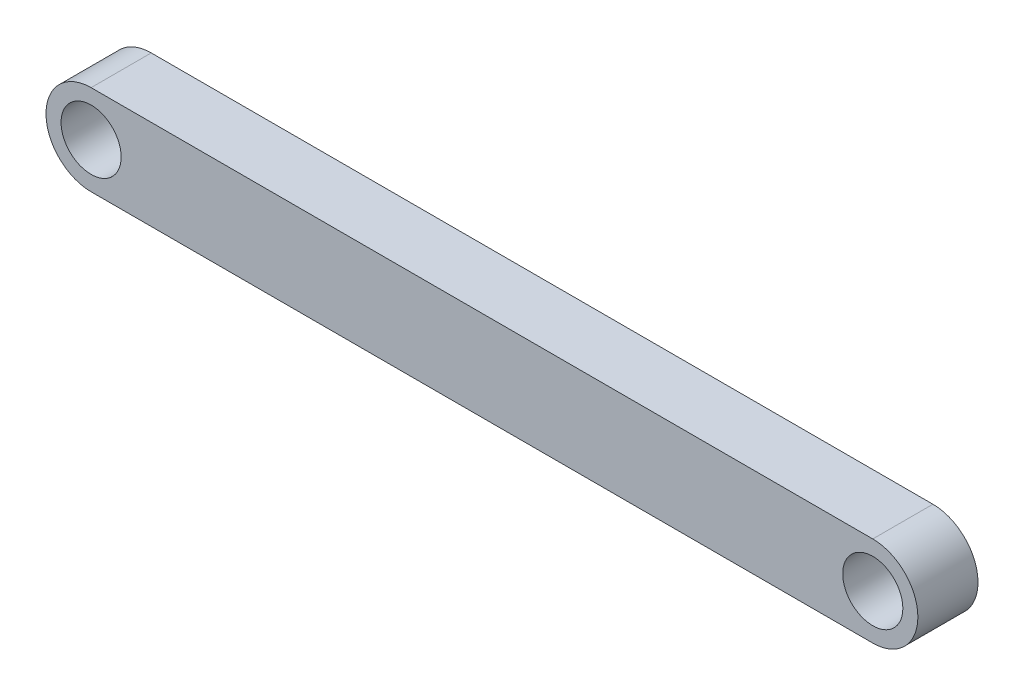
ISO-10303-21;
HEADER;
FILE_DESCRIPTION(('STEP AP214'),'2;1');
FILE_NAME('part.step','',(''),(''),'','','');
FILE_SCHEMA(('AUTOMOTIVE_DESIGN { 1 0 10303 214 1 1 1 1 }'));
ENDSEC;
DATA;
#1=APPLICATION_CONTEXT('core data for automotive mechanical design processes');
#2=APPLICATION_PROTOCOL_DEFINITION('international standard','automotive_design',2000,#1);
#3=PRODUCT_CONTEXT('',#1,'mechanical');
#4=PRODUCT('Part','Part','',(#3));
#5=PRODUCT_RELATED_PRODUCT_CATEGORY('part','',(#4));
#6=PRODUCT_DEFINITION_FORMATION('','',#4);
#7=PRODUCT_DEFINITION_CONTEXT('part definition',#1,'design');
#8=PRODUCT_DEFINITION('design','',#6,#7);
#9=PRODUCT_DEFINITION_SHAPE('','',#8);
#10=(LENGTH_UNIT() NAMED_UNIT(*) SI_UNIT(.MILLI.,.METRE.));
#11=(NAMED_UNIT(*) PLANE_ANGLE_UNIT() SI_UNIT($,.RADIAN.));
#12=(NAMED_UNIT(*) SI_UNIT($,.STERADIAN.) SOLID_ANGLE_UNIT());
#13=UNCERTAINTY_MEASURE_WITH_UNIT(LENGTH_MEASURE(1.E-05),#10,'distance_accuracy_value','');
#14=(GEOMETRIC_REPRESENTATION_CONTEXT(3) GLOBAL_UNCERTAINTY_ASSIGNED_CONTEXT((#13)) GLOBAL_UNIT_ASSIGNED_CONTEXT((#10,
#11,#12)) REPRESENTATION_CONTEXT('',''));
#15=CARTESIAN_POINT('',(0.,0.,0.));
#16=DIRECTION('',(0.,0.,1.));
#17=DIRECTION('',(1.,0.,0.));
#18=AXIS2_PLACEMENT_3D('',#15,#16,#17);
#19=CARTESIAN_POINT('',(0.,0.,6.35));
#20=DIRECTION('',(0.,0.,1.));
#21=DIRECTION('',(1.,0.,0.));
#22=AXIS2_PLACEMENT_3D('',#19,#20,#21);
#23=PLANE('',#22);
#24=CARTESIAN_POINT('',(82.55,0.,6.35));
#25=DIRECTION('',(0.,0.,1.));
#26=DIRECTION('',(1.,0.,0.));
#27=AXIS2_PLACEMENT_3D('',#24,#25,#26);
#28=CIRCLE('',#27,3.175);
#29=CARTESIAN_POINT('',(85.725,0.,6.35));
#30=VERTEX_POINT('',#29);
#31=EDGE_CURVE('E116',#30,#30,#28,.T.);
#32=ORIENTED_EDGE('',*,*,#31,.F.);
#33=EDGE_LOOP('',(#32));
#34=FACE_BOUND('',#33,.T.);
#35=CARTESIAN_POINT('',(0.,0.,6.35));
#36=DIRECTION('',(0.,0.,1.));
#37=DIRECTION('',(1.,0.,0.));
#38=AXIS2_PLACEMENT_3D('',#35,#36,#37);
#39=CIRCLE('',#38,4.7625);
#40=CARTESIAN_POINT('',(0.,4.7625,6.35));
#41=VERTEX_POINT('',#40);
#42=CARTESIAN_POINT('',(0.,-4.7625,6.35));
#43=VERTEX_POINT('',#42);
#44=EDGE_CURVE('E96',#41,#43,#39,.T.);
#45=ORIENTED_EDGE('',*,*,#44,.T.);
#46=DIRECTION('',(1.,0.,0.));
#47=VECTOR('',#46,1.);
#48=CARTESIAN_POINT('',(0.,-4.7625,6.35));
#49=LINE('',#48,#47);
#50=CARTESIAN_POINT('',(82.55,-4.7625,6.35));
#51=VERTEX_POINT('',#50);
#52=EDGE_CURVE('E91',#43,#51,#49,.T.);
#53=ORIENTED_EDGE('',*,*,#52,.T.);
#54=CARTESIAN_POINT('',(82.55,0.,6.35));
#55=DIRECTION('',(0.,0.,1.));
#56=DIRECTION('',(1.,0.,0.));
#57=AXIS2_PLACEMENT_3D('',#54,#55,#56);
#58=CIRCLE('',#57,4.7625);
#59=CARTESIAN_POINT('',(82.55,4.7625,6.35));
#60=VERTEX_POINT('',#59);
#61=EDGE_CURVE('E94',#51,#60,#58,.T.);
#62=ORIENTED_EDGE('',*,*,#61,.T.);
#63=DIRECTION('',(-1.,0.,0.));
#64=VECTOR('',#63,1.);
#65=CARTESIAN_POINT('',(0.,4.7625,6.35));
#66=LINE('',#65,#64);
#67=EDGE_CURVE('E61',#60,#41,#66,.T.);
#68=ORIENTED_EDGE('',*,*,#67,.T.);
#69=EDGE_LOOP('',(#45,#53,#62,#68));
#70=FACE_BOUND('',#69,.T.);
#71=CARTESIAN_POINT('',(0.,0.,6.35));
#72=DIRECTION('',(0.,0.,1.));
#73=DIRECTION('',(1.,0.,0.));
#74=AXIS2_PLACEMENT_3D('',#71,#72,#73);
#75=CIRCLE('',#74,3.175);
#76=CARTESIAN_POINT('',(3.175,0.,6.35));
#77=VERTEX_POINT('',#76);
#78=EDGE_CURVE('E138',#77,#77,#75,.T.);
#79=ORIENTED_EDGE('',*,*,#78,.F.);
#80=EDGE_LOOP('',(#79));
#81=FACE_BOUND('',#80,.T.);
#82=ADVANCED_FACE('F43',(#34,#70,#81),#23,.T.);
#83=CARTESIAN_POINT('',(0.,0.,0.));
#84=DIRECTION('',(0.,0.,1.));
#85=DIRECTION('',(1.,0.,0.));
#86=AXIS2_PLACEMENT_3D('',#83,#84,#85);
#87=PLANE('',#86);
#88=CARTESIAN_POINT('',(0.,0.,0.));
#89=DIRECTION('',(0.,0.,1.));
#90=DIRECTION('',(1.,0.,0.));
#91=AXIS2_PLACEMENT_3D('',#88,#89,#90);
#92=CIRCLE('',#91,4.7625);
#93=CARTESIAN_POINT('',(0.,4.7625,0.));
#94=VERTEX_POINT('',#93);
#95=CARTESIAN_POINT('',(0.,-4.7625,0.));
#96=VERTEX_POINT('',#95);
#97=EDGE_CURVE('E112',#94,#96,#92,.T.);
#98=ORIENTED_EDGE('',*,*,#97,.F.);
#99=DIRECTION('',(-1.,0.,0.));
#100=VECTOR('',#99,1.);
#101=CARTESIAN_POINT('',(0.,4.7625,0.));
#102=LINE('',#101,#100);
#103=CARTESIAN_POINT('',(82.55,4.7625,0.));
#104=VERTEX_POINT('',#103);
#105=EDGE_CURVE('E84',#104,#94,#102,.T.);
#106=ORIENTED_EDGE('',*,*,#105,.F.);
#107=CARTESIAN_POINT('',(82.55,0.,0.));
#108=DIRECTION('',(0.,0.,1.));
#109=DIRECTION('',(1.,0.,0.));
#110=AXIS2_PLACEMENT_3D('',#107,#108,#109);
#111=CIRCLE('',#110,4.7625);
#112=CARTESIAN_POINT('',(82.55,-4.7625,0.));
#113=VERTEX_POINT('',#112);
#114=EDGE_CURVE('E78',#113,#104,#111,.T.);
#115=ORIENTED_EDGE('',*,*,#114,.F.);
#116=DIRECTION('',(1.,0.,0.));
#117=VECTOR('',#116,1.);
#118=CARTESIAN_POINT('',(0.,-4.7625,0.));
#119=LINE('',#118,#117);
#120=EDGE_CURVE('E101',#96,#113,#119,.T.);
#121=ORIENTED_EDGE('',*,*,#120,.F.);
#122=EDGE_LOOP('',(#98,#106,#115,#121));
#123=FACE_BOUND('',#122,.T.);
#124=CARTESIAN_POINT('',(82.55,0.,0.));
#125=DIRECTION('',(0.,0.,1.));
#126=DIRECTION('',(1.,0.,0.));
#127=AXIS2_PLACEMENT_3D('',#124,#125,#126);
#128=CIRCLE('',#127,3.175);
#129=CARTESIAN_POINT('',(85.725,0.,0.));
#130=VERTEX_POINT('',#129);
#131=EDGE_CURVE('E134',#130,#130,#128,.T.);
#132=ORIENTED_EDGE('',*,*,#131,.T.);
#133=EDGE_LOOP('',(#132));
#134=FACE_BOUND('',#133,.T.);
#135=CARTESIAN_POINT('',(0.,0.,0.));
#136=DIRECTION('',(0.,0.,1.));
#137=DIRECTION('',(1.,0.,0.));
#138=AXIS2_PLACEMENT_3D('',#135,#136,#137);
#139=CIRCLE('',#138,3.175);
#140=CARTESIAN_POINT('',(3.175,0.,0.));
#141=VERTEX_POINT('',#140);
#142=EDGE_CURVE('E142',#141,#141,#139,.T.);
#143=ORIENTED_EDGE('',*,*,#142,.T.);
#144=EDGE_LOOP('',(#143));
#145=FACE_BOUND('',#144,.T.);
#146=ADVANCED_FACE('F129',(#123,#134,#145),#87,.F.);
#147=CARTESIAN_POINT('',(0.,0.,6.35));
#148=DIRECTION('',(0.,0.,-1.));
#149=DIRECTION('',(-1.,0.,0.));
#150=AXIS2_PLACEMENT_3D('',#147,#148,#149);
#151=CYLINDRICAL_SURFACE('',#150,4.7625);
#152=ORIENTED_EDGE('',*,*,#97,.T.);
#153=DIRECTION('',(0.,0.,-1.));
#154=VECTOR('',#153,1.);
#155=CARTESIAN_POINT('',(0.,-4.7625,6.35));
#156=LINE('',#155,#154);
#157=EDGE_CURVE('E11',#43,#96,#156,.T.);
#158=ORIENTED_EDGE('',*,*,#157,.F.);
#159=ORIENTED_EDGE('',*,*,#44,.F.);
#160=DIRECTION('',(0.,0.,-1.));
#161=VECTOR('',#160,1.);
#162=CARTESIAN_POINT('',(0.,4.7625,6.35));
#163=LINE('',#162,#161);
#164=EDGE_CURVE('E108',#41,#94,#163,.T.);
#165=ORIENTED_EDGE('',*,*,#164,.T.);
#166=EDGE_LOOP('',(#152,#158,#159,#165));
#167=FACE_BOUND('',#166,.T.);
#168=ADVANCED_FACE('F45',(#167),#151,.T.);
#169=CARTESIAN_POINT('',(0.,-4.7625,6.35));
#170=DIRECTION('',(0.,1.,0.));
#171=DIRECTION('',(0.,0.,1.));
#172=AXIS2_PLACEMENT_3D('',#169,#170,#171);
#173=PLANE('',#172);
#174=ORIENTED_EDGE('',*,*,#120,.T.);
#175=DIRECTION('',(0.,0.,-1.));
#176=VECTOR('',#175,1.);
#177=CARTESIAN_POINT('',(82.55,-4.7625,6.35));
#178=LINE('',#177,#176);
#179=EDGE_CURVE('E53',#51,#113,#178,.T.);
#180=ORIENTED_EDGE('',*,*,#179,.F.);
#181=ORIENTED_EDGE('',*,*,#52,.F.);
#182=ORIENTED_EDGE('',*,*,#157,.T.);
#183=EDGE_LOOP('',(#174,#180,#181,#182));
#184=FACE_BOUND('',#183,.T.);
#185=ADVANCED_FACE('F100',(#184),#173,.F.);
#186=CARTESIAN_POINT('',(82.55,0.,6.35));
#187=DIRECTION('',(0.,0.,-1.));
#188=DIRECTION('',(-1.,0.,0.));
#189=AXIS2_PLACEMENT_3D('',#186,#187,#188);
#190=CYLINDRICAL_SURFACE('',#189,4.7625);
#191=ORIENTED_EDGE('',*,*,#114,.T.);
#192=DIRECTION('',(0.,0.,-1.));
#193=VECTOR('',#192,1.);
#194=CARTESIAN_POINT('',(82.55,4.7625,6.35));
#195=LINE('',#194,#193);
#196=EDGE_CURVE('E103',#60,#104,#195,.T.);
#197=ORIENTED_EDGE('',*,*,#196,.F.);
#198=ORIENTED_EDGE('',*,*,#61,.F.);
#199=ORIENTED_EDGE('',*,*,#179,.T.);
#200=EDGE_LOOP('',(#191,#197,#198,#199));
#201=FACE_BOUND('',#200,.T.);
#202=ADVANCED_FACE('F104',(#201),#190,.T.);
#203=CARTESIAN_POINT('',(0.,4.7625,6.35));
#204=DIRECTION('',(0.,-1.,0.));
#205=DIRECTION('',(0.,0.,-1.));
#206=AXIS2_PLACEMENT_3D('',#203,#204,#205);
#207=PLANE('',#206);
#208=ORIENTED_EDGE('',*,*,#105,.T.);
#209=ORIENTED_EDGE('',*,*,#164,.F.);
#210=ORIENTED_EDGE('',*,*,#67,.F.);
#211=ORIENTED_EDGE('',*,*,#196,.T.);
#212=EDGE_LOOP('',(#208,#209,#210,#211));
#213=FACE_BOUND('',#212,.T.);
#214=ADVANCED_FACE('F126',(#213),#207,.F.);
#215=CARTESIAN_POINT('',(82.55,0.,6.35));
#216=DIRECTION('',(0.,0.,-1.));
#217=DIRECTION('',(-1.,0.,0.));
#218=AXIS2_PLACEMENT_3D('',#215,#216,#217);
#219=CYLINDRICAL_SURFACE('',#218,3.175);
#220=ORIENTED_EDGE('',*,*,#31,.T.);
#221=EDGE_LOOP('',(#220));
#222=FACE_BOUND('',#221,.T.);
#223=ORIENTED_EDGE('',*,*,#131,.F.);
#224=EDGE_LOOP('',(#223));
#225=FACE_BOUND('',#224,.T.);
#226=ADVANCED_FACE('F161',(#222,#225),#219,.F.);
#227=CARTESIAN_POINT('',(0.,0.,6.35));
#228=DIRECTION('',(0.,0.,-1.));
#229=DIRECTION('',(-1.,0.,0.));
#230=AXIS2_PLACEMENT_3D('',#227,#228,#229);
#231=CYLINDRICAL_SURFACE('',#230,3.175);
#232=ORIENTED_EDGE('',*,*,#78,.T.);
#233=EDGE_LOOP('',(#232));
#234=FACE_BOUND('',#233,.T.);
#235=ORIENTED_EDGE('',*,*,#142,.F.);
#236=EDGE_LOOP('',(#235));
#237=FACE_BOUND('',#236,.T.);
#238=ADVANCED_FACE('F150',(#234,#237),#231,.F.);
#239=CLOSED_SHELL('',(#82,#146,#168,#185,#202,#214,#226,#238));
#240=MANIFOLD_SOLID_BREP('B2',#239);
#241=ADVANCED_BREP_SHAPE_REPRESENTATION('',(#18,#240),#14);
#242=SHAPE_DEFINITION_REPRESENTATION(#9,#241);
ENDSEC;
END-ISO-10303-21;
